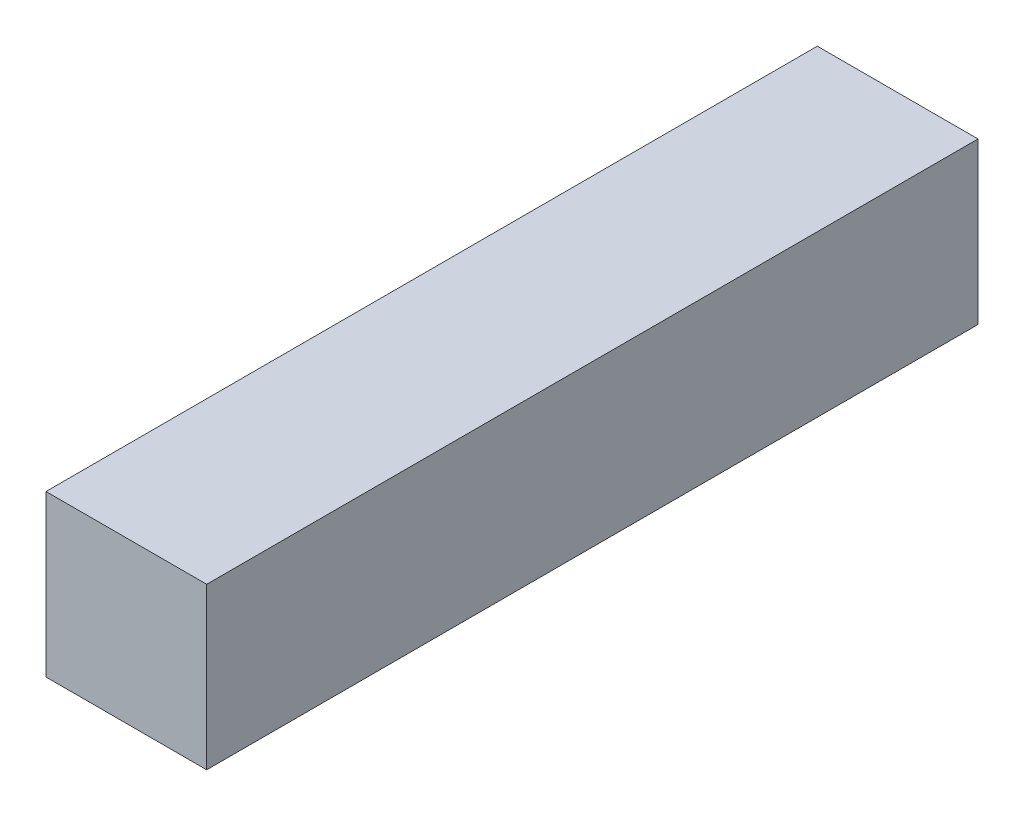
ISO-10303-21;
HEADER;
FILE_DESCRIPTION(('STEP AP214'),'2;1');
FILE_NAME('part.step','',(''),(''),'','','');
FILE_SCHEMA(('AUTOMOTIVE_DESIGN { 1 0 10303 214 1 1 1 1 }'));
ENDSEC;
DATA;
#1=APPLICATION_CONTEXT('core data for automotive mechanical design processes');
#2=APPLICATION_PROTOCOL_DEFINITION('international standard','automotive_design',2000,#1);
#3=PRODUCT_CONTEXT('',#1,'mechanical');
#4=PRODUCT('Part','Part','',(#3));
#5=PRODUCT_RELATED_PRODUCT_CATEGORY('part','',(#4));
#6=PRODUCT_DEFINITION_FORMATION('','',#4);
#7=PRODUCT_DEFINITION_CONTEXT('part definition',#1,'design');
#8=PRODUCT_DEFINITION('design','',#6,#7);
#9=PRODUCT_DEFINITION_SHAPE('','',#8);
#10=(LENGTH_UNIT() NAMED_UNIT(*) SI_UNIT(.MILLI.,.METRE.));
#11=(NAMED_UNIT(*) PLANE_ANGLE_UNIT() SI_UNIT($,.RADIAN.));
#12=(NAMED_UNIT(*) SI_UNIT($,.STERADIAN.) SOLID_ANGLE_UNIT());
#13=UNCERTAINTY_MEASURE_WITH_UNIT(LENGTH_MEASURE(1.E-05),#10,'distance_accuracy_value','');
#14=(GEOMETRIC_REPRESENTATION_CONTEXT(3) GLOBAL_UNCERTAINTY_ASSIGNED_CONTEXT((#13)) GLOBAL_UNIT_ASSIGNED_CONTEXT((#10,
#11,#12)) REPRESENTATION_CONTEXT('',''));
#15=CARTESIAN_POINT('',(0.,0.,0.));
#16=DIRECTION('',(0.,0.,1.));
#17=DIRECTION('',(1.,0.,0.));
#18=AXIS2_PLACEMENT_3D('',#15,#16,#17);
#19=CARTESIAN_POINT('',(5.,5.,24.));
#20=DIRECTION('',(-1.,0.,0.));
#21=DIRECTION('',(0.,-1.,0.));
#22=AXIS2_PLACEMENT_3D('',#19,#20,#21);
#23=PLANE('',#22);
#24=DIRECTION('',(0.,1.,0.));
#25=VECTOR('',#24,1.);
#26=CARTESIAN_POINT('',(5.,5.,-24.));
#27=LINE('',#26,#25);
#28=CARTESIAN_POINT('',(5.,-5.,-24.));
#29=VERTEX_POINT('',#28);
#30=CARTESIAN_POINT('',(5.,5.,-24.));
#31=VERTEX_POINT('',#30);
#32=EDGE_CURVE('E96',#29,#31,#27,.T.);
#33=ORIENTED_EDGE('',*,*,#32,.T.);
#34=DIRECTION('',(0.,0.,-1.));
#35=VECTOR('',#34,1.);
#36=CARTESIAN_POINT('',(5.,5.,24.));
#37=LINE('',#36,#35);
#38=CARTESIAN_POINT('',(5.,5.,24.));
#39=VERTEX_POINT('',#38);
#40=EDGE_CURVE('E11',#39,#31,#37,.T.);
#41=ORIENTED_EDGE('',*,*,#40,.F.);
#42=DIRECTION('',(0.,1.,0.));
#43=VECTOR('',#42,1.);
#44=CARTESIAN_POINT('',(5.,5.,24.));
#45=LINE('',#44,#43);
#46=CARTESIAN_POINT('',(5.,-5.,24.));
#47=VERTEX_POINT('',#46);
#48=EDGE_CURVE('E84',#47,#39,#45,.T.);
#49=ORIENTED_EDGE('',*,*,#48,.F.);
#50=DIRECTION('',(0.,0.,-1.));
#51=VECTOR('',#50,1.);
#52=CARTESIAN_POINT('',(5.,-5.,24.));
#53=LINE('',#52,#51);
#54=EDGE_CURVE('E92',#47,#29,#53,.T.);
#55=ORIENTED_EDGE('',*,*,#54,.T.);
#56=EDGE_LOOP('',(#33,#41,#49,#55));
#57=FACE_BOUND('',#56,.T.);
#58=ADVANCED_FACE('F33',(#57),#23,.F.);
#59=CARTESIAN_POINT('',(-5.,5.,24.));
#60=DIRECTION('',(0.,-1.,0.));
#61=DIRECTION('',(0.,0.,-1.));
#62=AXIS2_PLACEMENT_3D('',#59,#60,#61);
#63=PLANE('',#62);
#64=DIRECTION('',(-1.,0.,0.));
#65=VECTOR('',#64,1.);
#66=CARTESIAN_POINT('',(-5.,5.,-24.));
#67=LINE('',#66,#65);
#68=CARTESIAN_POINT('',(-5.,5.,-24.));
#69=VERTEX_POINT('',#68);
#70=EDGE_CURVE('E88',#31,#69,#67,.T.);
#71=ORIENTED_EDGE('',*,*,#70,.T.);
#72=DIRECTION('',(0.,0.,-1.));
#73=VECTOR('',#72,1.);
#74=CARTESIAN_POINT('',(-5.,5.,24.));
#75=LINE('',#74,#73);
#76=CARTESIAN_POINT('',(-5.,5.,24.));
#77=VERTEX_POINT('',#76);
#78=EDGE_CURVE('E41',#77,#69,#75,.T.);
#79=ORIENTED_EDGE('',*,*,#78,.F.);
#80=DIRECTION('',(-1.,0.,0.));
#81=VECTOR('',#80,1.);
#82=CARTESIAN_POINT('',(-5.,5.,24.));
#83=LINE('',#82,#81);
#84=EDGE_CURVE('E79',#39,#77,#83,.T.);
#85=ORIENTED_EDGE('',*,*,#84,.F.);
#86=ORIENTED_EDGE('',*,*,#40,.T.);
#87=EDGE_LOOP('',(#71,#79,#85,#86));
#88=FACE_BOUND('',#87,.T.);
#89=ADVANCED_FACE('F87',(#88),#63,.F.);
#90=CARTESIAN_POINT('',(-5.,5.,24.));
#91=DIRECTION('',(1.,0.,0.));
#92=DIRECTION('',(0.,0.,-1.));
#93=AXIS2_PLACEMENT_3D('',#90,#91,#92);
#94=PLANE('',#93);
#95=DIRECTION('',(0.,-1.,0.));
#96=VECTOR('',#95,1.);
#97=CARTESIAN_POINT('',(-5.,5.,-24.));
#98=LINE('',#97,#96);
#99=CARTESIAN_POINT('',(-5.,-5.,-24.));
#100=VERTEX_POINT('',#99);
#101=EDGE_CURVE('E66',#69,#100,#98,.T.);
#102=ORIENTED_EDGE('',*,*,#101,.T.);
#103=DIRECTION('',(0.,0.,-1.));
#104=VECTOR('',#103,1.);
#105=CARTESIAN_POINT('',(-5.,-5.,24.));
#106=LINE('',#105,#104);
#107=CARTESIAN_POINT('',(-5.,-5.,24.));
#108=VERTEX_POINT('',#107);
#109=EDGE_CURVE('E89',#108,#100,#106,.T.);
#110=ORIENTED_EDGE('',*,*,#109,.F.);
#111=DIRECTION('',(0.,-1.,0.));
#112=VECTOR('',#111,1.);
#113=CARTESIAN_POINT('',(-5.,5.,24.));
#114=LINE('',#113,#112);
#115=EDGE_CURVE('E82',#77,#108,#114,.T.);
#116=ORIENTED_EDGE('',*,*,#115,.F.);
#117=ORIENTED_EDGE('',*,*,#78,.T.);
#118=EDGE_LOOP('',(#102,#110,#116,#117));
#119=FACE_BOUND('',#118,.T.);
#120=ADVANCED_FACE('F90',(#119),#94,.F.);
#121=CARTESIAN_POINT('',(-5.,-5.,24.));
#122=DIRECTION('',(0.,1.,0.));
#123=DIRECTION('',(0.,0.,1.));
#124=AXIS2_PLACEMENT_3D('',#121,#122,#123);
#125=PLANE('',#124);
#126=DIRECTION('',(1.,0.,0.));
#127=VECTOR('',#126,1.);
#128=CARTESIAN_POINT('',(-5.,-5.,-24.));
#129=LINE('',#128,#127);
#130=EDGE_CURVE('E72',#100,#29,#129,.T.);
#131=ORIENTED_EDGE('',*,*,#130,.T.);
#132=ORIENTED_EDGE('',*,*,#54,.F.);
#133=DIRECTION('',(1.,0.,0.));
#134=VECTOR('',#133,1.);
#135=CARTESIAN_POINT('',(-5.,-5.,24.));
#136=LINE('',#135,#134);
#137=EDGE_CURVE('E49',#108,#47,#136,.T.);
#138=ORIENTED_EDGE('',*,*,#137,.F.);
#139=ORIENTED_EDGE('',*,*,#109,.T.);
#140=EDGE_LOOP('',(#131,#132,#138,#139));
#141=FACE_BOUND('',#140,.T.);
#142=ADVANCED_FACE('F103',(#141),#125,.F.);
#143=CARTESIAN_POINT('',(0.,0.,24.));
#144=DIRECTION('',(0.,0.,1.));
#145=DIRECTION('',(1.,0.,0.));
#146=AXIS2_PLACEMENT_3D('',#143,#144,#145);
#147=PLANE('',#146);
#148=ORIENTED_EDGE('',*,*,#48,.T.);
#149=ORIENTED_EDGE('',*,*,#84,.T.);
#150=ORIENTED_EDGE('',*,*,#115,.T.);
#151=ORIENTED_EDGE('',*,*,#137,.T.);
#152=EDGE_LOOP('',(#148,#149,#150,#151));
#153=FACE_BOUND('',#152,.T.);
#154=ADVANCED_FACE('F80',(#153),#147,.T.);
#155=CARTESIAN_POINT('',(0.,0.,-24.));
#156=DIRECTION('',(0.,0.,1.));
#157=DIRECTION('',(1.,0.,0.));
#158=AXIS2_PLACEMENT_3D('',#155,#156,#157);
#159=PLANE('',#158);
#160=ORIENTED_EDGE('',*,*,#32,.F.);
#161=ORIENTED_EDGE('',*,*,#130,.F.);
#162=ORIENTED_EDGE('',*,*,#101,.F.);
#163=ORIENTED_EDGE('',*,*,#70,.F.);
#164=EDGE_LOOP('',(#160,#161,#162,#163));
#165=FACE_BOUND('',#164,.T.);
#166=ADVANCED_FACE('F106',(#165),#159,.F.);
#167=CLOSED_SHELL('',(#58,#89,#120,#142,#154,#166));
#168=MANIFOLD_SOLID_BREP('B2',#167);
#169=ADVANCED_BREP_SHAPE_REPRESENTATION('',(#18,#168),#14);
#170=SHAPE_DEFINITION_REPRESENTATION(#9,#169);
ENDSEC;
END-ISO-10303-21;
